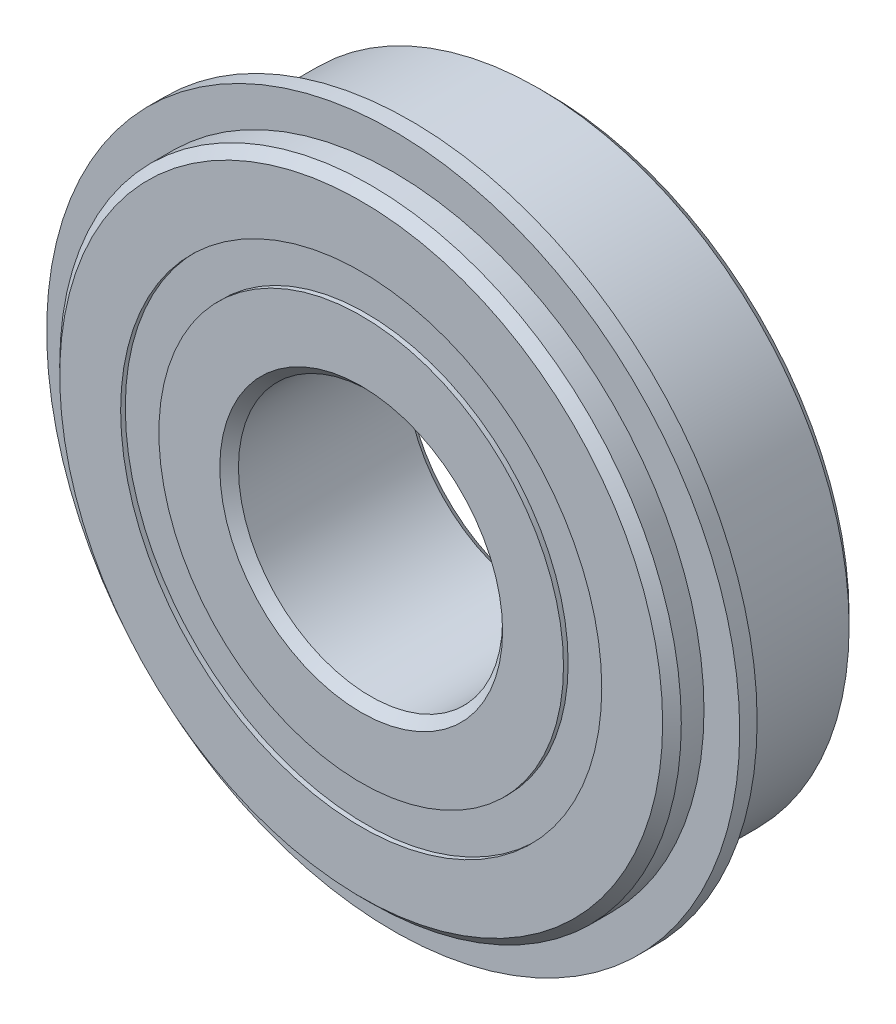
ISO-10303-21;
HEADER;
FILE_DESCRIPTION(('STEP AP214'),'2;1');
FILE_NAME('part.step','',(''),(''),'','','');
FILE_SCHEMA(('AUTOMOTIVE_DESIGN { 1 0 10303 214 1 1 1 1 }'));
ENDSEC;
DATA;
#1=APPLICATION_CONTEXT('core data for automotive mechanical design processes');
#2=APPLICATION_PROTOCOL_DEFINITION('international standard','automotive_design',2000,#1);
#3=PRODUCT_CONTEXT('',#1,'mechanical');
#4=PRODUCT('Part','Part','',(#3));
#5=PRODUCT_RELATED_PRODUCT_CATEGORY('part','',(#4));
#6=PRODUCT_DEFINITION_FORMATION('','',#4);
#7=PRODUCT_DEFINITION_CONTEXT('part definition',#1,'design');
#8=PRODUCT_DEFINITION('design','',#6,#7);
#9=PRODUCT_DEFINITION_SHAPE('','',#8);
#10=(LENGTH_UNIT() NAMED_UNIT(*) SI_UNIT(.MILLI.,.METRE.));
#11=(NAMED_UNIT(*) PLANE_ANGLE_UNIT() SI_UNIT($,.RADIAN.));
#12=(NAMED_UNIT(*) SI_UNIT($,.STERADIAN.) SOLID_ANGLE_UNIT());
#13=UNCERTAINTY_MEASURE_WITH_UNIT(LENGTH_MEASURE(1.E-05),#10,'distance_accuracy_value','');
#14=(GEOMETRIC_REPRESENTATION_CONTEXT(3) GLOBAL_UNCERTAINTY_ASSIGNED_CONTEXT((#13)) GLOBAL_UNIT_ASSIGNED_CONTEXT((#10,
#11,#12)) REPRESENTATION_CONTEXT('',''));
#15=CARTESIAN_POINT('',(0.,0.,0.));
#16=DIRECTION('',(0.,0.,1.));
#17=DIRECTION('',(1.,0.,0.));
#18=AXIS2_PLACEMENT_3D('',#15,#16,#17);
#19=CARTESIAN_POINT('',(0.,15.4807692307692,-5.70000000000001));
#20=DIRECTION('',(0.,0.,1.));
#21=DIRECTION('',(1.,0.,0.));
#22=AXIS2_PLACEMENT_3D('',#19,#20,#21);
#23=PLANE('',#22);
#24=CARTESIAN_POINT('',(0.,0.,-5.70000000000001));
#25=DIRECTION('',(0.,0.,1.));
#26=DIRECTION('',(1.,0.,0.));
#27=AXIS2_PLACEMENT_3D('',#24,#25,#26);
#28=CIRCLE('',#27,15.4807692307692);
#29=CARTESIAN_POINT('',(15.4807692307692,0.,-5.70000000000001));
#30=VERTEX_POINT('',#29);
#31=EDGE_CURVE('E53',#30,#30,#28,.T.);
#32=ORIENTED_EDGE('',*,*,#31,.F.);
#33=EDGE_LOOP('',(#32));
#34=FACE_BOUND('',#33,.T.);
#35=CARTESIAN_POINT('',(0.,0.,-5.70000000000001));
#36=DIRECTION('',(0.,0.,1.));
#37=DIRECTION('',(1.,0.,0.));
#38=AXIS2_PLACEMENT_3D('',#35,#36,#37);
#39=CIRCLE('',#38,13.0192307692308);
#40=CARTESIAN_POINT('',(13.0192307692308,0.,-5.70000000000001));
#41=VERTEX_POINT('',#40);
#42=EDGE_CURVE('E11',#41,#41,#39,.T.);
#43=ORIENTED_EDGE('',*,*,#42,.T.);
#44=EDGE_LOOP('',(#43));
#45=FACE_BOUND('',#44,.T.);
#46=ADVANCED_FACE('F39',(#34,#45),#23,.F.);
#47=CARTESIAN_POINT('',(0.,0.,6.));
#48=DIRECTION('',(0.,0.,1.));
#49=DIRECTION('',(1.,0.,0.));
#50=AXIS2_PLACEMENT_3D('',#47,#48,#49);
#51=CYLINDRICAL_SURFACE('',#50,13.0192307692308);
#52=ORIENTED_EDGE('',*,*,#42,.F.);
#53=EDGE_LOOP('',(#52));
#54=FACE_BOUND('',#53,.T.);
#55=CARTESIAN_POINT('',(0.,0.,-2.93698893605669));
#56=DIRECTION('',(0.,0.,1.));
#57=DIRECTION('',(1.,0.,0.));
#58=AXIS2_PLACEMENT_3D('',#55,#56,#57);
#59=CIRCLE('',#58,13.0192307692308);
#60=CARTESIAN_POINT('',(13.0192307692308,0.,-2.93698893605669));
#61=VERTEX_POINT('',#60);
#62=EDGE_CURVE('E45',#61,#61,#59,.T.);
#63=ORIENTED_EDGE('',*,*,#62,.T.);
#64=EDGE_LOOP('',(#63));
#65=FACE_BOUND('',#64,.T.);
#66=ADVANCED_FACE('F62',(#54,#65),#51,.F.);
#67=CARTESIAN_POINT('',(0.,15.4807692307692,-2.93698893605669));
#68=DIRECTION('',(0.,0.,-1.));
#69=DIRECTION('',(-1.,0.,0.));
#70=AXIS2_PLACEMENT_3D('',#67,#68,#69);
#71=PLANE('',#70);
#72=ORIENTED_EDGE('',*,*,#62,.F.);
#73=EDGE_LOOP('',(#72));
#74=FACE_BOUND('',#73,.T.);
#75=CARTESIAN_POINT('',(0.,0.,-2.93698893605669));
#76=DIRECTION('',(0.,0.,1.));
#77=DIRECTION('',(1.,0.,0.));
#78=AXIS2_PLACEMENT_3D('',#75,#76,#77);
#79=CIRCLE('',#78,15.4807692307692);
#80=CARTESIAN_POINT('',(15.4807692307692,0.,-2.93698893605669));
#81=VERTEX_POINT('',#80);
#82=EDGE_CURVE('E49',#81,#81,#79,.T.);
#83=ORIENTED_EDGE('',*,*,#82,.T.);
#84=EDGE_LOOP('',(#83));
#85=FACE_BOUND('',#84,.T.);
#86=ADVANCED_FACE('F66',(#74,#85),#71,.F.);
#87=CARTESIAN_POINT('',(0.,0.,6.));
#88=DIRECTION('',(0.,0.,1.));
#89=DIRECTION('',(1.,0.,0.));
#90=AXIS2_PLACEMENT_3D('',#87,#88,#89);
#91=CYLINDRICAL_SURFACE('',#90,15.4807692307692);
#92=ORIENTED_EDGE('',*,*,#82,.F.);
#93=EDGE_LOOP('',(#92));
#94=FACE_BOUND('',#93,.T.);
#95=ORIENTED_EDGE('',*,*,#31,.T.);
#96=EDGE_LOOP('',(#95));
#97=FACE_BOUND('',#96,.T.);
#98=ADVANCED_FACE('F59',(#94,#97),#91,.T.);
#99=CLOSED_SHELL('',(#46,#66,#86,#98));
#100=MANIFOLD_SOLID_BREP('B2',#99);
#101=CARTESIAN_POINT('',(-6.18284328242504,12.8388063676096,0.));
#102=DIRECTION('',(0.,0.,1.));
#103=DIRECTION('',(-0.433883739117546,0.900968867902425,0.));
#104=AXIS2_PLACEMENT_3D('',#101,#102,#103);
#105=SPHERICAL_SURFACE('',#104,2.93698893605669);
#106=CARTESIAN_POINT('',(-6.18284328242504,12.8388063676096,2.93698893605668));
#107=VERTEX_POINT('',#106);
#108=VERTEX_LOOP('',#107);
#109=FACE_BOUND('',#108,.T.);
#110=ADVANCED_FACE('F106',(#109),#105,.T.);
#111=CLOSED_SHELL('',(#110));
#112=MANIFOLD_SOLID_BREP('B6',#111);
#113=CARTESIAN_POINT('',(-11.1410986251693,8.88472967648709,0.));
#114=DIRECTION('',(0.,0.,1.));
#115=DIRECTION('',(-0.781831482468022,0.623489801858743,0.));
#116=AXIS2_PLACEMENT_3D('',#113,#114,#115);
#117=SPHERICAL_SURFACE('',#116,2.93698893605669);
#118=CARTESIAN_POINT('',(-11.1410986251693,8.88472967648709,2.93698893605668));
#119=VERTEX_POINT('',#118);
#120=VERTEX_LOOP('',#119);
#121=FACE_BOUND('',#120,.T.);
#122=ADVANCED_FACE('F126',(#121),#117,.T.);
#123=CLOSED_SHELL('',(#122));
#124=MANIFOLD_SOLID_BREP('B35',#123);
#125=CARTESIAN_POINT('',(-13.892722748591,3.17092330887763,0.));
#126=DIRECTION('',(0.,0.,1.));
#127=DIRECTION('',(-0.974927912181821,0.222520933956325,0.));
#128=AXIS2_PLACEMENT_3D('',#125,#126,#127);
#129=SPHERICAL_SURFACE('',#128,2.93698893605669);
#130=CARTESIAN_POINT('',(-13.892722748591,3.17092330887763,2.93698893605668));
#131=VERTEX_POINT('',#130);
#132=VERTEX_LOOP('',#131);
#133=FACE_BOUND('',#132,.T.);
#134=ADVANCED_FACE('F146',(#133),#129,.T.);
#135=CLOSED_SHELL('',(#134));
#136=MANIFOLD_SOLID_BREP('B102',#135);
#137=CARTESIAN_POINT('',(-13.892722748591,-3.17092330887735,0.));
#138=DIRECTION('',(0.,0.,1.));
#139=DIRECTION('',(-0.974927912181826,-0.222520933956305,0.));
#140=AXIS2_PLACEMENT_3D('',#137,#138,#139);
#141=SPHERICAL_SURFACE('',#140,2.93698893605669);
#142=CARTESIAN_POINT('',(-13.892722748591,-3.17092330887735,2.93698893605668));
#143=VERTEX_POINT('',#142);
#144=VERTEX_LOOP('',#143);
#145=FACE_BOUND('',#144,.T.);
#146=ADVANCED_FACE('F166',(#145),#141,.T.);
#147=CLOSED_SHELL('',(#146));
#148=MANIFOLD_SOLID_BREP('B122',#147);
#149=CARTESIAN_POINT('',(-11.1410986251695,-8.88472967648686,0.));
#150=DIRECTION('',(0.,0.,1.));
#151=DIRECTION('',(-0.781831482468035,-0.623489801858727,0.));
#152=AXIS2_PLACEMENT_3D('',#149,#150,#151);
#153=SPHERICAL_SURFACE('',#152,2.93698893605669);
#154=CARTESIAN_POINT('',(-11.1410986251695,-8.88472967648686,2.93698893605668));
#155=VERTEX_POINT('',#154);
#156=VERTEX_LOOP('',#155);
#157=FACE_BOUND('',#156,.T.);
#158=ADVANCED_FACE('F186',(#157),#153,.T.);
#159=CLOSED_SHELL('',(#158));
#160=MANIFOLD_SOLID_BREP('B142',#159);
#161=CARTESIAN_POINT('',(-6.1828432824253,-12.8388063676094,0.));
#162=DIRECTION('',(0.,0.,1.));
#163=DIRECTION('',(-0.433883739117565,-0.900968867902416,0.));
#164=AXIS2_PLACEMENT_3D('',#161,#162,#163);
#165=SPHERICAL_SURFACE('',#164,2.93698893605669);
#166=CARTESIAN_POINT('',(-6.1828432824253,-12.8388063676094,2.93698893605668));
#167=VERTEX_POINT('',#166);
#168=VERTEX_LOOP('',#167);
#169=FACE_BOUND('',#168,.T.);
#170=ADVANCED_FACE('F206',(#169),#165,.T.);
#171=CLOSED_SHELL('',(#170));
#172=MANIFOLD_SOLID_BREP('B162',#171);
#173=CARTESIAN_POINT('',(0.,-14.25,0.));
#174=DIRECTION('',(0.,0.,1.));
#175=DIRECTION('',(0.,-1.,0.));
#176=AXIS2_PLACEMENT_3D('',#173,#174,#175);
#177=SPHERICAL_SURFACE('',#176,2.93698893605669);
#178=CARTESIAN_POINT('',(0.,-14.25,2.93698893605668));
#179=VERTEX_POINT('',#178);
#180=VERTEX_LOOP('',#179);
#181=FACE_BOUND('',#180,.T.);
#182=ADVANCED_FACE('F226',(#181),#177,.T.);
#183=CLOSED_SHELL('',(#182));
#184=MANIFOLD_SOLID_BREP('B182',#183);
#185=CARTESIAN_POINT('',(6.18284328242513,-12.8388063676095,0.));
#186=DIRECTION('',(0.,0.,1.));
#187=DIRECTION('',(0.433883739117553,-0.900968867902422,0.));
#188=AXIS2_PLACEMENT_3D('',#185,#186,#187);
#189=SPHERICAL_SURFACE('',#188,2.93698893605669);
#190=CARTESIAN_POINT('',(6.18284328242513,-12.8388063676095,2.93698893605668));
#191=VERTEX_POINT('',#190);
#192=VERTEX_LOOP('',#191);
#193=FACE_BOUND('',#192,.T.);
#194=ADVANCED_FACE('F246',(#193),#189,.T.);
#195=CLOSED_SHELL('',(#194));
#196=MANIFOLD_SOLID_BREP('B202',#195);
#197=CARTESIAN_POINT('',(11.1410986251694,-8.88472967648701,0.));
#198=DIRECTION('',(0.,0.,1.));
#199=DIRECTION('',(0.781831482468027,-0.623489801858737,0.));
#200=AXIS2_PLACEMENT_3D('',#197,#198,#199);
#201=SPHERICAL_SURFACE('',#200,2.93698893605669);
#202=CARTESIAN_POINT('',(11.1410986251694,-8.88472967648701,2.93698893605668));
#203=VERTEX_POINT('',#202);
#204=VERTEX_LOOP('',#203);
#205=FACE_BOUND('',#204,.T.);
#206=ADVANCED_FACE('F266',(#205),#201,.T.);
#207=CLOSED_SHELL('',(#206));
#208=MANIFOLD_SOLID_BREP('B222',#207);
#209=CARTESIAN_POINT('',(13.892722748591,-3.17092330887753,0.));
#210=DIRECTION('',(0.,0.,1.));
#211=DIRECTION('',(0.974927912181823,-0.222520933956318,0.));
#212=AXIS2_PLACEMENT_3D('',#209,#210,#211);
#213=SPHERICAL_SURFACE('',#212,2.93698893605669);
#214=CARTESIAN_POINT('',(13.892722748591,-3.17092330887753,2.93698893605668));
#215=VERTEX_POINT('',#214);
#216=VERTEX_LOOP('',#215);
#217=FACE_BOUND('',#216,.T.);
#218=ADVANCED_FACE('F286',(#217),#213,.T.);
#219=CLOSED_SHELL('',(#218));
#220=MANIFOLD_SOLID_BREP('B242',#219);
#221=CARTESIAN_POINT('',(13.892722748591,3.17092330887744,0.));
#222=DIRECTION('',(0.,0.,1.));
#223=DIRECTION('',(0.974927912181824,0.222520933956311,0.));
#224=AXIS2_PLACEMENT_3D('',#221,#222,#223);
#225=SPHERICAL_SURFACE('',#224,2.93698893605669);
#226=CARTESIAN_POINT('',(13.892722748591,3.17092330887744,2.93698893605668));
#227=VERTEX_POINT('',#226);
#228=VERTEX_LOOP('',#227);
#229=FACE_BOUND('',#228,.T.);
#230=ADVANCED_FACE('F306',(#229),#225,.T.);
#231=CLOSED_SHELL('',(#230));
#232=MANIFOLD_SOLID_BREP('B262',#231);
#233=CARTESIAN_POINT('',(11.1410986251694,8.88472967648693,0.));
#234=DIRECTION('',(0.,0.,1.));
#235=DIRECTION('',(0.781831482468031,0.623489801858732,0.));
#236=AXIS2_PLACEMENT_3D('',#233,#234,#235);
#237=SPHERICAL_SURFACE('',#236,2.93698893605669);
#238=CARTESIAN_POINT('',(11.1410986251694,8.88472967648693,2.93698893605668));
#239=VERTEX_POINT('',#238);
#240=VERTEX_LOOP('',#239);
#241=FACE_BOUND('',#240,.T.);
#242=ADVANCED_FACE('F326',(#241),#237,.T.);
#243=CLOSED_SHELL('',(#242));
#244=MANIFOLD_SOLID_BREP('B282',#243);
#245=CARTESIAN_POINT('',(6.18284328242522,12.8388063676095,0.));
#246=DIRECTION('',(0.,0.,1.));
#247=DIRECTION('',(0.433883739117559,0.900968867902419,0.));
#248=AXIS2_PLACEMENT_3D('',#245,#246,#247);
#249=SPHERICAL_SURFACE('',#248,2.93698893605669);
#250=CARTESIAN_POINT('',(6.18284328242522,12.8388063676095,2.93698893605668));
#251=VERTEX_POINT('',#250);
#252=VERTEX_LOOP('',#251);
#253=FACE_BOUND('',#252,.T.);
#254=ADVANCED_FACE('F346',(#253),#249,.T.);
#255=CLOSED_SHELL('',(#254));
#256=MANIFOLD_SOLID_BREP('B302',#255);
#257=CARTESIAN_POINT('',(0.,14.25,0.));
#258=DIRECTION('',(0.,0.,1.));
#259=DIRECTION('',(0.,1.,0.));
#260=AXIS2_PLACEMENT_3D('',#257,#258,#259);
#261=SPHERICAL_SURFACE('',#260,2.93698893605669);
#262=CARTESIAN_POINT('',(0.,14.25,2.93698893605668));
#263=VERTEX_POINT('',#262);
#264=VERTEX_LOOP('',#263);
#265=FACE_BOUND('',#264,.T.);
#266=ADVANCED_FACE('F367',(#265),#261,.T.);
#267=CLOSED_SHELL('',(#266));
#268=MANIFOLD_SOLID_BREP('B322',#267);
#269=CARTESIAN_POINT('',(0.,0.,6.));
#270=DIRECTION('',(0.,0.,1.));
#271=DIRECTION('',(1.,0.,0.));
#272=AXIS2_PLACEMENT_3D('',#269,#270,#271);
#273=CYLINDRICAL_SURFACE('',#272,15.4807692307692);
#274=CARTESIAN_POINT('',(0.,0.,6.));
#275=DIRECTION('',(0.,0.,1.));
#276=DIRECTION('',(1.,0.,0.));
#277=AXIS2_PLACEMENT_3D('',#274,#275,#276);
#278=CIRCLE('',#277,15.4807692307692);
#279=CARTESIAN_POINT('',(15.4807692307692,0.,6.));
#280=VERTEX_POINT('',#279);
#281=EDGE_CURVE('E417',#280,#280,#278,.T.);
#282=ORIENTED_EDGE('',*,*,#281,.T.);
#283=EDGE_LOOP('',(#282));
#284=FACE_BOUND('',#283,.T.);
#285=CARTESIAN_POINT('',(0.,0.,5.7));
#286=DIRECTION('',(0.,0.,-1.));
#287=DIRECTION('',(-1.,0.,0.));
#288=AXIS2_PLACEMENT_3D('',#285,#286,#287);
#289=CIRCLE('',#288,15.4807692307692);
#290=CARTESIAN_POINT('',(-15.4807692307692,0.,5.7));
#291=VERTEX_POINT('',#290);
#292=EDGE_CURVE('E366',#291,#291,#289,.F.);
#293=ORIENTED_EDGE('',*,*,#292,.F.);
#294=EDGE_LOOP('',(#293));
#295=FACE_BOUND('',#294,.T.);
#296=ADVANCED_FACE('F379',(#284,#295),#273,.F.);
#297=CARTESIAN_POINT('',(0.,0.,2.66666666666666));
#298=DIRECTION('',(0.,0.,1.));
#299=DIRECTION('',(1.,0.,0.));
#300=AXIS2_PLACEMENT_3D('',#297,#298,#299);
#301=CIRCLE('',#300,15.4807692307692);
#302=CARTESIAN_POINT('',(15.4807692307692,0.,2.66666666666666));
#303=VERTEX_POINT('',#302);
#304=EDGE_CURVE('E414',#303,#303,#301,.T.);
#305=ORIENTED_EDGE('',*,*,#304,.F.);
#306=EDGE_LOOP('',(#305));
#307=FACE_BOUND('',#306,.T.);
#308=CARTESIAN_POINT('',(0.,0.,2.93698893605668));
#309=DIRECTION('',(0.,0.,1.));
#310=DIRECTION('',(1.,0.,0.));
#311=AXIS2_PLACEMENT_3D('',#308,#309,#310);
#312=CIRCLE('',#311,15.4807692307692);
#313=CARTESIAN_POINT('',(15.4807692307692,0.,2.93698893605668));
#314=VERTEX_POINT('',#313);
#315=EDGE_CURVE('E386',#314,#314,#312,.F.);
#316=ORIENTED_EDGE('',*,*,#315,.F.);
#317=EDGE_LOOP('',(#316));
#318=FACE_BOUND('',#317,.T.);
#319=ADVANCED_FACE('F490',(#307,#318),#273,.F.);
#320=CARTESIAN_POINT('',(0.,0.,6.));
#321=DIRECTION('',(0.,0.,1.));
#322=DIRECTION('',(1.,0.,0.));
#323=AXIS2_PLACEMENT_3D('',#320,#321,#322);
#324=CYLINDRICAL_SURFACE('',#323,20.);
#325=CARTESIAN_POINT('',(0.,0.,5.4));
#326=DIRECTION('',(0.,0.,1.));
#327=DIRECTION('',(1.,0.,0.));
#328=AXIS2_PLACEMENT_3D('',#325,#326,#327);
#329=CIRCLE('',#328,20.);
#330=CARTESIAN_POINT('',(20.,0.,5.4));
#331=VERTEX_POINT('',#330);
#332=EDGE_CURVE('E399',#331,#331,#329,.T.);
#333=ORIENTED_EDGE('',*,*,#332,.F.);
#334=EDGE_LOOP('',(#333));
#335=FACE_BOUND('',#334,.T.);
#336=CARTESIAN_POINT('',(0.,0.,3.94));
#337=DIRECTION('',(0.,0.,-1.));
#338=DIRECTION('',(-1.,0.,0.));
#339=AXIS2_PLACEMENT_3D('',#336,#337,#338);
#340=CIRCLE('',#339,20.);
#341=CARTESIAN_POINT('',(-20.,0.,3.94));
#342=VERTEX_POINT('',#341);
#343=EDGE_CURVE('E390',#342,#342,#340,.T.);
#344=ORIENTED_EDGE('',*,*,#343,.F.);
#345=EDGE_LOOP('',(#344));
#346=FACE_BOUND('',#345,.T.);
#347=ADVANCED_FACE('F496',(#335,#346),#324,.T.);
#348=CARTESIAN_POINT('',(0.,0.,-5.40000000000001));
#349=DIRECTION('',(0.,0.,1.));
#350=DIRECTION('',(1.,0.,0.));
#351=AXIS2_PLACEMENT_3D('',#348,#349,#350);
#352=CIRCLE('',#351,20.);
#353=CARTESIAN_POINT('',(20.,0.,-5.40000000000001));
#354=VERTEX_POINT('',#353);
#355=EDGE_CURVE('E402',#354,#354,#352,.T.);
#356=ORIENTED_EDGE('',*,*,#355,.T.);
#357=EDGE_LOOP('',(#356));
#358=FACE_BOUND('',#357,.T.);
#359=CARTESIAN_POINT('',(0.,0.,2.82));
#360=DIRECTION('',(0.,0.,1.));
#361=DIRECTION('',(1.,0.,0.));
#362=AXIS2_PLACEMENT_3D('',#359,#360,#361);
#363=CIRCLE('',#362,20.);
#364=CARTESIAN_POINT('',(20.,0.,2.82));
#365=VERTEX_POINT('',#364);
#366=EDGE_CURVE('E394',#365,#365,#363,.T.);
#367=ORIENTED_EDGE('',*,*,#366,.F.);
#368=EDGE_LOOP('',(#367));
#369=FACE_BOUND('',#368,.T.);
#370=ADVANCED_FACE('F519',(#358,#369),#324,.T.);
#371=CARTESIAN_POINT('',(0.,0.,5.4));
#372=DIRECTION('',(0.,0.,-1.));
#373=DIRECTION('',(-1.,0.,0.));
#374=AXIS2_PLACEMENT_3D('',#371,#372,#373);
#375=CONICAL_SURFACE('',#374,20.,0.785398163397445);
#376=CARTESIAN_POINT('',(0.,0.,6.));
#377=DIRECTION('',(0.,0.,1.));
#378=DIRECTION('',(1.,0.,0.));
#379=AXIS2_PLACEMENT_3D('',#376,#377,#378);
#380=CIRCLE('',#379,19.4);
#381=CARTESIAN_POINT('',(19.4,0.,6.));
#382=VERTEX_POINT('',#381);
#383=EDGE_CURVE('E420',#382,#382,#380,.T.);
#384=ORIENTED_EDGE('',*,*,#383,.F.);
#385=EDGE_LOOP('',(#384));
#386=FACE_BOUND('',#385,.T.);
#387=ORIENTED_EDGE('',*,*,#332,.T.);
#388=EDGE_LOOP('',(#387));
#389=FACE_BOUND('',#388,.T.);
#390=ADVANCED_FACE('F381',(#386,#389),#375,.T.);
#391=CARTESIAN_POINT('',(0.,0.,-6.00000000000001));
#392=DIRECTION('',(0.,0.,1.));
#393=DIRECTION('',(1.,0.,0.));
#394=AXIS2_PLACEMENT_3D('',#391,#392,#393);
#395=CONICAL_SURFACE('',#394,19.4,0.785398163397445);
#396=ORIENTED_EDGE('',*,*,#355,.F.);
#397=EDGE_LOOP('',(#396));
#398=FACE_BOUND('',#397,.T.);
#399=CARTESIAN_POINT('',(0.,0.,-6.00000000000001));
#400=DIRECTION('',(0.,0.,1.));
#401=DIRECTION('',(1.,0.,0.));
#402=AXIS2_PLACEMENT_3D('',#399,#400,#401);
#403=CIRCLE('',#402,19.4);
#404=CARTESIAN_POINT('',(19.4,0.,-6.00000000000001));
#405=VERTEX_POINT('',#404);
#406=EDGE_CURVE('E405',#405,#405,#403,.T.);
#407=ORIENTED_EDGE('',*,*,#406,.T.);
#408=EDGE_LOOP('',(#407));
#409=FACE_BOUND('',#408,.T.);
#410=ADVANCED_FACE('F514',(#398,#409),#395,.T.);
#411=CARTESIAN_POINT('',(0.,19.4,-6.00000000000001));
#412=DIRECTION('',(0.,0.,1.));
#413=DIRECTION('',(1.,0.,0.));
#414=AXIS2_PLACEMENT_3D('',#411,#412,#413);
#415=PLANE('',#414);
#416=ORIENTED_EDGE('',*,*,#406,.F.);
#417=EDGE_LOOP('',(#416));
#418=FACE_BOUND('',#417,.T.);
#419=CARTESIAN_POINT('',(0.,0.,-6.00000000000001));
#420=DIRECTION('',(0.,0.,1.));
#421=DIRECTION('',(1.,0.,0.));
#422=AXIS2_PLACEMENT_3D('',#419,#420,#421);
#423=CIRCLE('',#422,15.4807692307692);
#424=CARTESIAN_POINT('',(15.4807692307692,0.,-6.00000000000001));
#425=VERTEX_POINT('',#424);
#426=EDGE_CURVE('E408',#425,#425,#423,.T.);
#427=ORIENTED_EDGE('',*,*,#426,.T.);
#428=EDGE_LOOP('',(#427));
#429=FACE_BOUND('',#428,.T.);
#430=ADVANCED_FACE('F510',(#418,#429),#415,.F.);
#431=CARTESIAN_POINT('',(0.,0.,6.));
#432=DIRECTION('',(0.,0.,1.));
#433=DIRECTION('',(1.,0.,0.));
#434=AXIS2_PLACEMENT_3D('',#431,#432,#433);
#435=CYLINDRICAL_SURFACE('',#434,15.4807692307692);
#436=ORIENTED_EDGE('',*,*,#426,.F.);
#437=EDGE_LOOP('',(#436));
#438=FACE_BOUND('',#437,.T.);
#439=CARTESIAN_POINT('',(0.,0.,-2.66666666666667));
#440=DIRECTION('',(0.,0.,1.));
#441=DIRECTION('',(1.,0.,0.));
#442=AXIS2_PLACEMENT_3D('',#439,#440,#441);
#443=CIRCLE('',#442,15.4807692307692);
#444=CARTESIAN_POINT('',(15.4807692307692,0.,-2.66666666666667));
#445=VERTEX_POINT('',#444);
#446=EDGE_CURVE('E411',#445,#445,#443,.T.);
#447=ORIENTED_EDGE('',*,*,#446,.T.);
#448=EDGE_LOOP('',(#447));
#449=FACE_BOUND('',#448,.T.);
#450=ADVANCED_FACE('F506',(#438,#449),#435,.F.);
#451=CARTESIAN_POINT('',(0.,0.,0.));
#452=DIRECTION('',(0.,0.,1.));
#453=DIRECTION('',(1.,0.,0.));
#454=AXIS2_PLACEMENT_3D('',#451,#452,#453);
#455=TOROIDAL_SURFACE('',#454,14.25,2.93698893605669);
#456=ORIENTED_EDGE('',*,*,#446,.F.);
#457=EDGE_LOOP('',(#456));
#458=FACE_BOUND('',#457,.T.);
#459=ORIENTED_EDGE('',*,*,#304,.T.);
#460=EDGE_LOOP('',(#459));
#461=FACE_BOUND('',#460,.T.);
#462=ADVANCED_FACE('F503',(#458,#461),#455,.F.);
#463=CARTESIAN_POINT('',(0.,19.4,6.));
#464=DIRECTION('',(0.,0.,-1.));
#465=DIRECTION('',(-1.,0.,0.));
#466=AXIS2_PLACEMENT_3D('',#463,#464,#465);
#467=PLANE('',#466);
#468=ORIENTED_EDGE('',*,*,#281,.F.);
#469=EDGE_LOOP('',(#468));
#470=FACE_BOUND('',#469,.T.);
#471=ORIENTED_EDGE('',*,*,#383,.T.);
#472=EDGE_LOOP('',(#471));
#473=FACE_BOUND('',#472,.T.);
#474=ADVANCED_FACE('F501',(#470,#473),#467,.F.);
#475=CARTESIAN_POINT('',(0.,22.3,3.94));
#476=DIRECTION('',(0.,0.,-1.));
#477=DIRECTION('',(-1.,0.,0.));
#478=AXIS2_PLACEMENT_3D('',#475,#476,#477);
#479=PLANE('',#478);
#480=CARTESIAN_POINT('',(0.,0.,3.94));
#481=DIRECTION('',(0.,0.,1.));
#482=DIRECTION('',(1.,0.,0.));
#483=AXIS2_PLACEMENT_3D('',#480,#481,#482);
#484=CIRCLE('',#483,22.3);
#485=CARTESIAN_POINT('',(22.3,0.,3.94));
#486=VERTEX_POINT('',#485);
#487=EDGE_CURVE('E426',#486,#486,#484,.T.);
#488=ORIENTED_EDGE('',*,*,#487,.T.);
#489=EDGE_LOOP('',(#488));
#490=FACE_BOUND('',#489,.T.);
#491=ORIENTED_EDGE('',*,*,#343,.T.);
#492=EDGE_LOOP('',(#491));
#493=FACE_BOUND('',#492,.T.);
#494=ADVANCED_FACE('F529',(#490,#493),#479,.F.);
#495=CARTESIAN_POINT('',(0.,22.3,2.82));
#496=DIRECTION('',(0.,0.,1.));
#497=DIRECTION('',(1.,0.,0.));
#498=AXIS2_PLACEMENT_3D('',#495,#496,#497);
#499=PLANE('',#498);
#500=CARTESIAN_POINT('',(0.,0.,2.82));
#501=DIRECTION('',(0.,0.,1.));
#502=DIRECTION('',(1.,0.,0.));
#503=AXIS2_PLACEMENT_3D('',#500,#501,#502);
#504=CIRCLE('',#503,22.3);
#505=CARTESIAN_POINT('',(22.3,0.,2.82));
#506=VERTEX_POINT('',#505);
#507=EDGE_CURVE('E423',#506,#506,#504,.T.);
#508=ORIENTED_EDGE('',*,*,#507,.F.);
#509=EDGE_LOOP('',(#508));
#510=FACE_BOUND('',#509,.T.);
#511=ORIENTED_EDGE('',*,*,#366,.T.);
#512=EDGE_LOOP('',(#511));
#513=FACE_BOUND('',#512,.T.);
#514=ADVANCED_FACE('F486',(#510,#513),#499,.F.);
#515=CARTESIAN_POINT('',(0.,0.,9.13349869253424));
#516=DIRECTION('',(0.,0.,1.));
#517=DIRECTION('',(1.,0.,0.));
#518=AXIS2_PLACEMENT_3D('',#515,#516,#517);
#519=CYLINDRICAL_SURFACE('',#518,22.3);
#520=ORIENTED_EDGE('',*,*,#487,.F.);
#521=EDGE_LOOP('',(#520));
#522=FACE_BOUND('',#521,.T.);
#523=ORIENTED_EDGE('',*,*,#507,.T.);
#524=EDGE_LOOP('',(#523));
#525=FACE_BOUND('',#524,.T.);
#526=ADVANCED_FACE('F479',(#522,#525),#519,.T.);
#527=CARTESIAN_POINT('',(0.,15.4807692307692,5.7));
#528=DIRECTION('',(0.,0.,-1.));
#529=DIRECTION('',(-1.,0.,0.));
#530=AXIS2_PLACEMENT_3D('',#527,#528,#529);
#531=PLANE('',#530);
#532=CARTESIAN_POINT('',(0.,0.,5.7));
#533=DIRECTION('',(0.,0.,1.));
#534=DIRECTION('',(1.,0.,0.));
#535=AXIS2_PLACEMENT_3D('',#532,#533,#534);
#536=CIRCLE('',#535,13.0192307692308);
#537=CARTESIAN_POINT('',(13.0192307692308,0.,5.7));
#538=VERTEX_POINT('',#537);
#539=EDGE_CURVE('E429',#538,#538,#536,.T.);
#540=ORIENTED_EDGE('',*,*,#539,.F.);
#541=EDGE_LOOP('',(#540));
#542=FACE_BOUND('',#541,.T.);
#543=ORIENTED_EDGE('',*,*,#292,.T.);
#544=EDGE_LOOP('',(#543));
#545=FACE_BOUND('',#544,.T.);
#546=ADVANCED_FACE('F477',(#542,#545),#531,.F.);
#547=CARTESIAN_POINT('',(0.,15.4807692307692,2.93698893605668));
#548=DIRECTION('',(0.,0.,1.));
#549=DIRECTION('',(1.,0.,0.));
#550=AXIS2_PLACEMENT_3D('',#547,#548,#549);
#551=PLANE('',#550);
#552=ORIENTED_EDGE('',*,*,#315,.T.);
#553=EDGE_LOOP('',(#552));
#554=FACE_BOUND('',#553,.T.);
#555=CARTESIAN_POINT('',(0.,0.,2.93698893605668));
#556=DIRECTION('',(0.,0.,1.));
#557=DIRECTION('',(1.,0.,0.));
#558=AXIS2_PLACEMENT_3D('',#555,#556,#557);
#559=CIRCLE('',#558,13.0192307692308);
#560=CARTESIAN_POINT('',(13.0192307692308,0.,2.93698893605668));
#561=VERTEX_POINT('',#560);
#562=EDGE_CURVE('E432',#561,#561,#559,.F.);
#563=ORIENTED_EDGE('',*,*,#562,.F.);
#564=EDGE_LOOP('',(#563));
#565=FACE_BOUND('',#564,.T.);
#566=ADVANCED_FACE('F473',(#554,#565),#551,.F.);
#567=CARTESIAN_POINT('',(0.,0.,6.));
#568=DIRECTION('',(0.,0.,1.));
#569=DIRECTION('',(1.,0.,0.));
#570=AXIS2_PLACEMENT_3D('',#567,#568,#569);
#571=CYLINDRICAL_SURFACE('',#570,13.0192307692308);
#572=CARTESIAN_POINT('',(0.,0.,6.));
#573=DIRECTION('',(0.,0.,1.));
#574=DIRECTION('',(1.,0.,0.));
#575=AXIS2_PLACEMENT_3D('',#572,#573,#574);
#576=CIRCLE('',#575,13.0192307692308);
#577=CARTESIAN_POINT('',(13.0192307692308,0.,6.));
#578=VERTEX_POINT('',#577);
#579=EDGE_CURVE('E435',#578,#578,#576,.T.);
#580=ORIENTED_EDGE('',*,*,#579,.F.);
#581=EDGE_LOOP('',(#580));
#582=FACE_BOUND('',#581,.T.);
#583=ORIENTED_EDGE('',*,*,#539,.T.);
#584=EDGE_LOOP('',(#583));
#585=FACE_BOUND('',#584,.T.);
#586=ADVANCED_FACE('F470',(#582,#585),#571,.T.);
#587=CARTESIAN_POINT('',(0.,0.,2.66666666666666));
#588=DIRECTION('',(0.,0.,1.));
#589=DIRECTION('',(1.,0.,0.));
#590=AXIS2_PLACEMENT_3D('',#587,#588,#589);
#591=CIRCLE('',#590,13.0192307692308);
#592=CARTESIAN_POINT('',(13.0192307692308,0.,2.66666666666666));
#593=VERTEX_POINT('',#592);
#594=EDGE_CURVE('E438',#593,#593,#591,.T.);
#595=ORIENTED_EDGE('',*,*,#594,.T.);
#596=EDGE_LOOP('',(#595));
#597=FACE_BOUND('',#596,.T.);
#598=ORIENTED_EDGE('',*,*,#562,.T.);
#599=EDGE_LOOP('',(#598));
#600=FACE_BOUND('',#599,.T.);
#601=ADVANCED_FACE('F466',(#597,#600),#571,.T.);
#602=CARTESIAN_POINT('',(0.,13.0192307692308,6.));
#603=DIRECTION('',(0.,0.,-1.));
#604=DIRECTION('',(-1.,0.,0.));
#605=AXIS2_PLACEMENT_3D('',#602,#603,#604);
#606=PLANE('',#605);
#607=CARTESIAN_POINT('',(0.,0.,6.));
#608=DIRECTION('',(0.,0.,1.));
#609=DIRECTION('',(1.,0.,0.));
#610=AXIS2_PLACEMENT_3D('',#607,#608,#609);
#611=CIRCLE('',#610,9.1);
#612=CARTESIAN_POINT('',(9.1,0.,6.));
#613=VERTEX_POINT('',#612);
#614=EDGE_CURVE('E456',#613,#613,#611,.T.);
#615=ORIENTED_EDGE('',*,*,#614,.F.);
#616=EDGE_LOOP('',(#615));
#617=FACE_BOUND('',#616,.T.);
#618=ORIENTED_EDGE('',*,*,#579,.T.);
#619=EDGE_LOOP('',(#618));
#620=FACE_BOUND('',#619,.T.);
#621=ADVANCED_FACE('F462',(#617,#620),#606,.F.);
#622=CARTESIAN_POINT('',(0.,0.,0.));
#623=DIRECTION('',(0.,0.,1.));
#624=DIRECTION('',(1.,0.,0.));
#625=AXIS2_PLACEMENT_3D('',#622,#623,#624);
#626=TOROIDAL_SURFACE('',#625,14.25,2.93698893605668);
#627=ORIENTED_EDGE('',*,*,#594,.F.);
#628=EDGE_LOOP('',(#627));
#629=FACE_BOUND('',#628,.T.);
#630=CARTESIAN_POINT('',(0.,0.,-2.66666666666667));
#631=DIRECTION('',(0.,0.,1.));
#632=DIRECTION('',(1.,0.,0.));
#633=AXIS2_PLACEMENT_3D('',#630,#631,#632);
#634=CIRCLE('',#633,13.0192307692308);
#635=CARTESIAN_POINT('',(13.0192307692308,0.,-2.66666666666667));
#636=VERTEX_POINT('',#635);
#637=EDGE_CURVE('E441',#636,#636,#634,.T.);
#638=ORIENTED_EDGE('',*,*,#637,.T.);
#639=EDGE_LOOP('',(#638));
#640=FACE_BOUND('',#639,.T.);
#641=ADVANCED_FACE('F465',(#629,#640),#626,.F.);
#642=CARTESIAN_POINT('',(0.,0.,6.));
#643=DIRECTION('',(0.,0.,1.));
#644=DIRECTION('',(1.,0.,0.));
#645=AXIS2_PLACEMENT_3D('',#642,#643,#644);
#646=CYLINDRICAL_SURFACE('',#645,13.0192307692308);
#647=ORIENTED_EDGE('',*,*,#637,.F.);
#648=EDGE_LOOP('',(#647));
#649=FACE_BOUND('',#648,.T.);
#650=CARTESIAN_POINT('',(0.,0.,-6.));
#651=DIRECTION('',(0.,0.,1.));
#652=DIRECTION('',(1.,0.,0.));
#653=AXIS2_PLACEMENT_3D('',#650,#651,#652);
#654=CIRCLE('',#653,13.0192307692308);
#655=CARTESIAN_POINT('',(13.0192307692308,0.,-6.));
#656=VERTEX_POINT('',#655);
#657=EDGE_CURVE('E444',#656,#656,#654,.T.);
#658=ORIENTED_EDGE('',*,*,#657,.T.);
#659=EDGE_LOOP('',(#658));
#660=FACE_BOUND('',#659,.T.);
#661=ADVANCED_FACE('F651',(#649,#660),#646,.T.);
#662=CARTESIAN_POINT('',(0.,9.1,-6.));
#663=DIRECTION('',(0.,0.,1.));
#664=DIRECTION('',(1.,0.,0.));
#665=AXIS2_PLACEMENT_3D('',#662,#663,#664);
#666=PLANE('',#665);
#667=ORIENTED_EDGE('',*,*,#657,.F.);
#668=EDGE_LOOP('',(#667));
#669=FACE_BOUND('',#668,.T.);
#670=CARTESIAN_POINT('',(0.,0.,-6.00000000000001));
#671=DIRECTION('',(0.,0.,1.));
#672=DIRECTION('',(1.,0.,0.));
#673=AXIS2_PLACEMENT_3D('',#670,#671,#672);
#674=CIRCLE('',#673,9.1);
#675=CARTESIAN_POINT('',(9.1,0.,-6.00000000000001));
#676=VERTEX_POINT('',#675);
#677=EDGE_CURVE('E447',#676,#676,#674,.T.);
#678=ORIENTED_EDGE('',*,*,#677,.T.);
#679=EDGE_LOOP('',(#678));
#680=FACE_BOUND('',#679,.T.);
#681=ADVANCED_FACE('F661',(#669,#680),#666,.F.);
#682=CARTESIAN_POINT('',(0.,0.,-5.40000000000001));
#683=DIRECTION('',(0.,0.,-1.));
#684=DIRECTION('',(-1.,0.,0.));
#685=AXIS2_PLACEMENT_3D('',#682,#683,#684);
#686=CONICAL_SURFACE('',#685,8.5,0.785398163397445);
#687=ORIENTED_EDGE('',*,*,#677,.F.);
#688=EDGE_LOOP('',(#687));
#689=FACE_BOUND('',#688,.T.);
#690=CARTESIAN_POINT('',(0.,0.,-5.40000000000001));
#691=DIRECTION('',(0.,0.,1.));
#692=DIRECTION('',(1.,0.,0.));
#693=AXIS2_PLACEMENT_3D('',#690,#691,#692);
#694=CIRCLE('',#693,8.5);
#695=CARTESIAN_POINT('',(8.5,0.,-5.40000000000001));
#696=VERTEX_POINT('',#695);
#697=EDGE_CURVE('E450',#696,#696,#694,.T.);
#698=ORIENTED_EDGE('',*,*,#697,.T.);
#699=EDGE_LOOP('',(#698));
#700=FACE_BOUND('',#699,.T.);
#701=ADVANCED_FACE('F671',(#689,#700),#686,.F.);
#702=CARTESIAN_POINT('',(0.,0.,6.));
#703=DIRECTION('',(0.,0.,1.));
#704=DIRECTION('',(1.,0.,0.));
#705=AXIS2_PLACEMENT_3D('',#702,#703,#704);
#706=CYLINDRICAL_SURFACE('',#705,8.5);
#707=ORIENTED_EDGE('',*,*,#697,.F.);
#708=EDGE_LOOP('',(#707));
#709=FACE_BOUND('',#708,.T.);
#710=CARTESIAN_POINT('',(0.,0.,5.40000000000001));
#711=DIRECTION('',(0.,0.,1.));
#712=DIRECTION('',(1.,0.,0.));
#713=AXIS2_PLACEMENT_3D('',#710,#711,#712);
#714=CIRCLE('',#713,8.5);
#715=CARTESIAN_POINT('',(8.5,0.,5.40000000000001));
#716=VERTEX_POINT('',#715);
#717=EDGE_CURVE('E453',#716,#716,#714,.T.);
#718=ORIENTED_EDGE('',*,*,#717,.T.);
#719=EDGE_LOOP('',(#718));
#720=FACE_BOUND('',#719,.T.);
#721=ADVANCED_FACE('F681',(#709,#720),#706,.F.);
#722=CARTESIAN_POINT('',(0.,0.,6.));
#723=DIRECTION('',(0.,0.,1.));
#724=DIRECTION('',(1.,0.,0.));
#725=AXIS2_PLACEMENT_3D('',#722,#723,#724);
#726=CONICAL_SURFACE('',#725,9.1,0.785398163397451);
#727=ORIENTED_EDGE('',*,*,#717,.F.);
#728=EDGE_LOOP('',(#727));
#729=FACE_BOUND('',#728,.T.);
#730=ORIENTED_EDGE('',*,*,#614,.T.);
#731=EDGE_LOOP('',(#730));
#732=FACE_BOUND('',#731,.T.);
#733=ADVANCED_FACE('F460',(#729,#732),#726,.F.);
#734=CLOSED_SHELL('',(#296,#319,#347,#370,#390,#410,#430,#450,#462,#474,#494,#514,#526,#546,
#566,#586,#601,#621,#641,#661,#681,#701,#721,#733));
#735=MANIFOLD_SOLID_BREP('B342',#734);
#736=ADVANCED_BREP_SHAPE_REPRESENTATION('',(#18,#100,#112,#124,#136,#148,#160,#172,#184,#196,
#208,#220,#232,#244,#256,#268,#735),#14);
#737=SHAPE_DEFINITION_REPRESENTATION(#9,#736);
ENDSEC;
END-ISO-10303-21;
